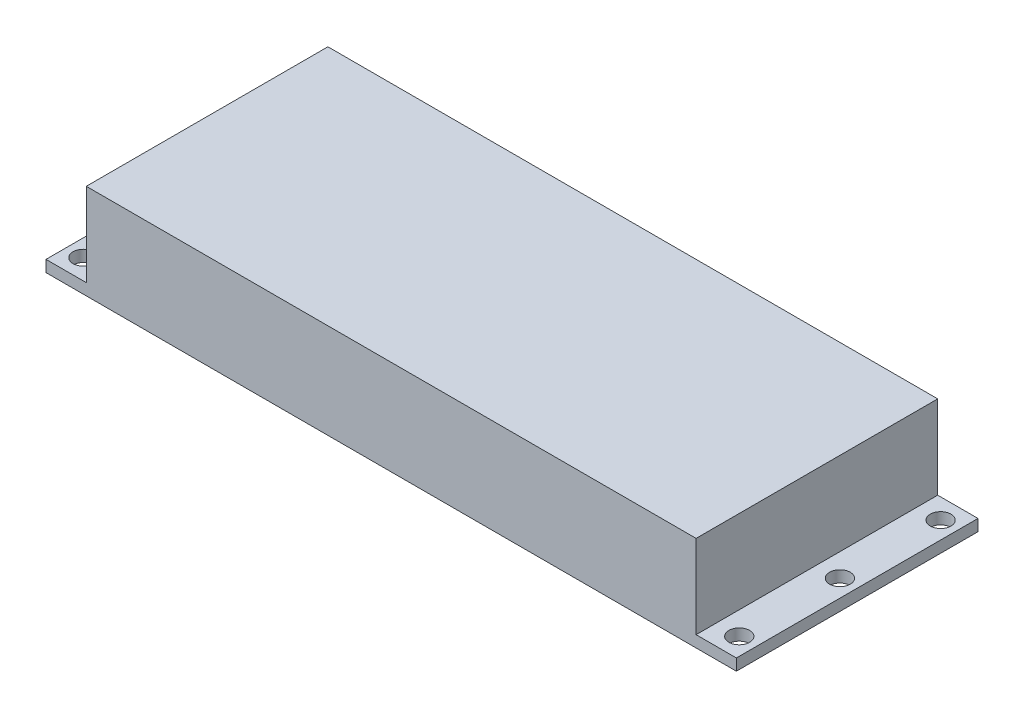
ISO-10303-21;
HEADER;
FILE_DESCRIPTION(('STEP AP214'),'2;1');
FILE_NAME('part.step','',(''),(''),'','','');
FILE_SCHEMA(('AUTOMOTIVE_DESIGN { 1 0 10303 214 1 1 1 1 }'));
ENDSEC;
DATA;
#1=APPLICATION_CONTEXT('core data for automotive mechanical design processes');
#2=APPLICATION_PROTOCOL_DEFINITION('international standard','automotive_design',2000,#1);
#3=PRODUCT_CONTEXT('',#1,'mechanical');
#4=PRODUCT('Part','Part','',(#3));
#5=PRODUCT_RELATED_PRODUCT_CATEGORY('part','',(#4));
#6=PRODUCT_DEFINITION_FORMATION('','',#4);
#7=PRODUCT_DEFINITION_CONTEXT('part definition',#1,'design');
#8=PRODUCT_DEFINITION('design','',#6,#7);
#9=PRODUCT_DEFINITION_SHAPE('','',#8);
#10=(LENGTH_UNIT() NAMED_UNIT(*) SI_UNIT(.MILLI.,.METRE.));
#11=(NAMED_UNIT(*) PLANE_ANGLE_UNIT() SI_UNIT($,.RADIAN.));
#12=(NAMED_UNIT(*) SI_UNIT($,.STERADIAN.) SOLID_ANGLE_UNIT());
#13=UNCERTAINTY_MEASURE_WITH_UNIT(LENGTH_MEASURE(1.E-05),#10,'distance_accuracy_value','');
#14=(GEOMETRIC_REPRESENTATION_CONTEXT(3) GLOBAL_UNCERTAINTY_ASSIGNED_CONTEXT((#13)) GLOBAL_UNIT_ASSIGNED_CONTEXT((#10,
#11,#12)) REPRESENTATION_CONTEXT('',''));
#15=CARTESIAN_POINT('',(0.,0.,0.));
#16=DIRECTION('',(0.,0.,1.));
#17=DIRECTION('',(1.,0.,0.));
#18=AXIS2_PLACEMENT_3D('',#15,#16,#17);
#19=CARTESIAN_POINT('',(0.,2.,0.));
#20=DIRECTION('',(0.,1.,0.));
#21=DIRECTION('',(0.,0.,1.));
#22=AXIS2_PLACEMENT_3D('',#19,#20,#21);
#23=PLANE('',#22);
#24=CARTESIAN_POINT('',(57.,2.,17.5));
#25=DIRECTION('',(0.,1.,0.));
#26=DIRECTION('',(0.,0.,1.));
#27=AXIS2_PLACEMENT_3D('',#24,#25,#26);
#28=CIRCLE('',#27,1.8);
#29=CARTESIAN_POINT('',(57.,2.,19.3));
#30=VERTEX_POINT('',#29);
#31=EDGE_CURVE('E188',#30,#30,#28,.T.);
#32=ORIENTED_EDGE('',*,*,#31,.F.);
#33=EDGE_LOOP('',(#32));
#34=FACE_BOUND('',#33,.T.);
#35=CARTESIAN_POINT('',(57.,2.,-17.5));
#36=DIRECTION('',(0.,1.,0.));
#37=DIRECTION('',(0.,0.,1.));
#38=AXIS2_PLACEMENT_3D('',#35,#36,#37);
#39=CIRCLE('',#38,1.8);
#40=CARTESIAN_POINT('',(57.,2.,-15.7));
#41=VERTEX_POINT('',#40);
#42=EDGE_CURVE('E182',#41,#41,#39,.T.);
#43=ORIENTED_EDGE('',*,*,#42,.F.);
#44=EDGE_LOOP('',(#43));
#45=FACE_BOUND('',#44,.T.);
#46=CARTESIAN_POINT('',(57.,2.,0.));
#47=DIRECTION('',(0.,1.,0.));
#48=DIRECTION('',(0.,0.,1.));
#49=AXIS2_PLACEMENT_3D('',#46,#47,#48);
#50=CIRCLE('',#49,1.8);
#51=CARTESIAN_POINT('',(57.,2.,1.8));
#52=VERTEX_POINT('',#51);
#53=EDGE_CURVE('E176',#52,#52,#50,.T.);
#54=ORIENTED_EDGE('',*,*,#53,.F.);
#55=EDGE_LOOP('',(#54));
#56=FACE_BOUND('',#55,.T.);
#57=DIRECTION('',(0.,0.,-1.));
#58=VECTOR('',#57,1.);
#59=CARTESIAN_POINT('',(53.,2.,-21.));
#60=LINE('',#59,#58);
#61=CARTESIAN_POINT('',(53.,2.,21.));
#62=VERTEX_POINT('',#61);
#63=CARTESIAN_POINT('',(53.,2.,-21.));
#64=VERTEX_POINT('',#63);
#65=EDGE_CURVE('E51',#62,#64,#60,.T.);
#66=ORIENTED_EDGE('',*,*,#65,.F.);
#67=DIRECTION('',(1.,0.,0.));
#68=VECTOR('',#67,1.);
#69=CARTESIAN_POINT('',(-60.,2.,21.));
#70=LINE('',#69,#68);
#71=CARTESIAN_POINT('',(60.,2.,21.));
#72=VERTEX_POINT('',#71);
#73=EDGE_CURVE('E149',#62,#72,#70,.T.);
#74=ORIENTED_EDGE('',*,*,#73,.T.);
#75=DIRECTION('',(0.,0.,-1.));
#76=VECTOR('',#75,1.);
#77=CARTESIAN_POINT('',(60.,2.,-21.));
#78=LINE('',#77,#76);
#79=CARTESIAN_POINT('',(60.,2.,-21.));
#80=VERTEX_POINT('',#79);
#81=EDGE_CURVE('E144',#72,#80,#78,.T.);
#82=ORIENTED_EDGE('',*,*,#81,.T.);
#83=DIRECTION('',(-1.,0.,0.));
#84=VECTOR('',#83,1.);
#85=CARTESIAN_POINT('',(-60.,2.,-21.));
#86=LINE('',#85,#84);
#87=EDGE_CURVE('E244',#80,#64,#86,.T.);
#88=ORIENTED_EDGE('',*,*,#87,.T.);
#89=EDGE_LOOP('',(#66,#74,#82,#88));
#90=FACE_BOUND('',#89,.T.);
#91=ADVANCED_FACE('F34',(#34,#45,#56,#90),#23,.T.);
#92=CARTESIAN_POINT('',(60.,2.,-21.));
#93=DIRECTION('',(-1.,0.,0.));
#94=DIRECTION('',(0.,0.,1.));
#95=AXIS2_PLACEMENT_3D('',#92,#93,#94);
#96=PLANE('',#95);
#97=DIRECTION('',(0.,0.,-1.));
#98=VECTOR('',#97,1.);
#99=CARTESIAN_POINT('',(60.,0.,-21.));
#100=LINE('',#99,#98);
#101=CARTESIAN_POINT('',(60.,0.,21.));
#102=VERTEX_POINT('',#101);
#103=CARTESIAN_POINT('',(60.,0.,-21.));
#104=VERTEX_POINT('',#103);
#105=EDGE_CURVE('E122',#102,#104,#100,.T.);
#106=ORIENTED_EDGE('',*,*,#105,.T.);
#107=DIRECTION('',(0.,-1.,0.));
#108=VECTOR('',#107,1.);
#109=CARTESIAN_POINT('',(60.,2.,-21.));
#110=LINE('',#109,#108);
#111=EDGE_CURVE('E11',#80,#104,#110,.T.);
#112=ORIENTED_EDGE('',*,*,#111,.F.);
#113=ORIENTED_EDGE('',*,*,#81,.F.);
#114=DIRECTION('',(0.,-1.,0.));
#115=VECTOR('',#114,1.);
#116=CARTESIAN_POINT('',(60.,2.,21.));
#117=LINE('',#116,#115);
#118=EDGE_CURVE('E232',#72,#102,#117,.T.);
#119=ORIENTED_EDGE('',*,*,#118,.T.);
#120=EDGE_LOOP('',(#106,#112,#113,#119));
#121=FACE_BOUND('',#120,.T.);
#122=ADVANCED_FACE('F36',(#121),#96,.F.);
#123=CARTESIAN_POINT('',(-60.,2.,-21.));
#124=DIRECTION('',(0.,0.,1.));
#125=DIRECTION('',(1.,0.,0.));
#126=AXIS2_PLACEMENT_3D('',#123,#124,#125);
#127=PLANE('',#126);
#128=DIRECTION('',(-1.,0.,0.));
#129=VECTOR('',#128,1.);
#130=CARTESIAN_POINT('',(-60.,0.,-21.));
#131=LINE('',#130,#129);
#132=CARTESIAN_POINT('',(-60.,0.,-21.));
#133=VERTEX_POINT('',#132);
#134=EDGE_CURVE('E125',#104,#133,#131,.T.);
#135=ORIENTED_EDGE('',*,*,#134,.T.);
#136=DIRECTION('',(0.,-1.,0.));
#137=VECTOR('',#136,1.);
#138=CARTESIAN_POINT('',(-60.,2.,-21.));
#139=LINE('',#138,#137);
#140=CARTESIAN_POINT('',(-60.,2.,-21.));
#141=VERTEX_POINT('',#140);
#142=EDGE_CURVE('E43',#141,#133,#139,.T.);
#143=ORIENTED_EDGE('',*,*,#142,.F.);
#144=CARTESIAN_POINT('',(-53.,2.,-21.));
#145=VERTEX_POINT('',#144);
#146=EDGE_CURVE('E247',#145,#141,#86,.T.);
#147=ORIENTED_EDGE('',*,*,#146,.F.);
#148=DIRECTION('',(0.,-1.,0.));
#149=VECTOR('',#148,1.);
#150=CARTESIAN_POINT('',(-53.,16.5,-21.));
#151=LINE('',#150,#149);
#152=CARTESIAN_POINT('',(-53.,16.5,-21.));
#153=VERTEX_POINT('',#152);
#154=EDGE_CURVE('E107',#153,#145,#151,.T.);
#155=ORIENTED_EDGE('',*,*,#154,.F.);
#156=DIRECTION('',(-1.,0.,0.));
#157=VECTOR('',#156,1.);
#158=CARTESIAN_POINT('',(-53.,16.5,-21.));
#159=LINE('',#158,#157);
#160=CARTESIAN_POINT('',(53.,16.5,-21.));
#161=VERTEX_POINT('',#160);
#162=EDGE_CURVE('E101',#161,#153,#159,.T.);
#163=ORIENTED_EDGE('',*,*,#162,.F.);
#164=DIRECTION('',(0.,-1.,0.));
#165=VECTOR('',#164,1.);
#166=CARTESIAN_POINT('',(53.,16.5,-21.));
#167=LINE('',#166,#165);
#168=EDGE_CURVE('E105',#161,#64,#167,.T.);
#169=ORIENTED_EDGE('',*,*,#168,.T.);
#170=ORIENTED_EDGE('',*,*,#87,.F.);
#171=ORIENTED_EDGE('',*,*,#111,.T.);
#172=EDGE_LOOP('',(#135,#143,#147,#155,#163,#169,#170,#171));
#173=FACE_BOUND('',#172,.T.);
#174=ADVANCED_FACE('F103',(#173),#127,.F.);
#175=CARTESIAN_POINT('',(-60.,2.,-21.));
#176=DIRECTION('',(1.,0.,0.));
#177=DIRECTION('',(0.,0.,-1.));
#178=AXIS2_PLACEMENT_3D('',#175,#176,#177);
#179=PLANE('',#178);
#180=DIRECTION('',(0.,0.,1.));
#181=VECTOR('',#180,1.);
#182=CARTESIAN_POINT('',(-60.,0.,-21.));
#183=LINE('',#182,#181);
#184=CARTESIAN_POINT('',(-60.,0.,21.));
#185=VERTEX_POINT('',#184);
#186=EDGE_CURVE('E254',#133,#185,#183,.T.);
#187=ORIENTED_EDGE('',*,*,#186,.T.);
#188=DIRECTION('',(0.,-1.,0.));
#189=VECTOR('',#188,1.);
#190=CARTESIAN_POINT('',(-60.,2.,21.));
#191=LINE('',#190,#189);
#192=CARTESIAN_POINT('',(-60.,2.,21.));
#193=VERTEX_POINT('',#192);
#194=EDGE_CURVE('E234',#193,#185,#191,.T.);
#195=ORIENTED_EDGE('',*,*,#194,.F.);
#196=DIRECTION('',(0.,0.,1.));
#197=VECTOR('',#196,1.);
#198=CARTESIAN_POINT('',(-60.,2.,-21.));
#199=LINE('',#198,#197);
#200=EDGE_CURVE('E246',#141,#193,#199,.T.);
#201=ORIENTED_EDGE('',*,*,#200,.F.);
#202=ORIENTED_EDGE('',*,*,#142,.T.);
#203=EDGE_LOOP('',(#187,#195,#201,#202));
#204=FACE_BOUND('',#203,.T.);
#205=ADVANCED_FACE('F259',(#204),#179,.F.);
#206=CARTESIAN_POINT('',(-60.,2.,21.));
#207=DIRECTION('',(0.,0.,-1.));
#208=DIRECTION('',(-1.,0.,0.));
#209=AXIS2_PLACEMENT_3D('',#206,#207,#208);
#210=PLANE('',#209);
#211=DIRECTION('',(1.,0.,0.));
#212=VECTOR('',#211,1.);
#213=CARTESIAN_POINT('',(-60.,0.,21.));
#214=LINE('',#213,#212);
#215=EDGE_CURVE('E226',#185,#102,#214,.T.);
#216=ORIENTED_EDGE('',*,*,#215,.T.);
#217=ORIENTED_EDGE('',*,*,#118,.F.);
#218=ORIENTED_EDGE('',*,*,#73,.F.);
#219=DIRECTION('',(0.,-1.,0.));
#220=VECTOR('',#219,1.);
#221=CARTESIAN_POINT('',(53.,16.5,21.));
#222=LINE('',#221,#220);
#223=CARTESIAN_POINT('',(53.,16.5,21.));
#224=VERTEX_POINT('',#223);
#225=EDGE_CURVE('E137',#224,#62,#222,.T.);
#226=ORIENTED_EDGE('',*,*,#225,.F.);
#227=DIRECTION('',(1.,0.,0.));
#228=VECTOR('',#227,1.);
#229=CARTESIAN_POINT('',(-53.,16.5,21.));
#230=LINE('',#229,#228);
#231=CARTESIAN_POINT('',(-53.,16.5,21.));
#232=VERTEX_POINT('',#231);
#233=EDGE_CURVE('E116',#232,#224,#230,.T.);
#234=ORIENTED_EDGE('',*,*,#233,.F.);
#235=DIRECTION('',(0.,-1.,0.));
#236=VECTOR('',#235,1.);
#237=CARTESIAN_POINT('',(-53.,16.5,21.));
#238=LINE('',#237,#236);
#239=CARTESIAN_POINT('',(-53.,2.,21.));
#240=VERTEX_POINT('',#239);
#241=EDGE_CURVE('E127',#232,#240,#238,.T.);
#242=ORIENTED_EDGE('',*,*,#241,.T.);
#243=EDGE_CURVE('E235',#193,#240,#70,.T.);
#244=ORIENTED_EDGE('',*,*,#243,.F.);
#245=ORIENTED_EDGE('',*,*,#194,.T.);
#246=EDGE_LOOP('',(#216,#217,#218,#226,#234,#242,#244,#245));
#247=FACE_BOUND('',#246,.T.);
#248=ADVANCED_FACE('F260',(#247),#210,.F.);
#249=CARTESIAN_POINT('',(-57.,2.,17.5));
#250=DIRECTION('',(0.,1.,0.));
#251=DIRECTION('',(0.,0.,1.));
#252=AXIS2_PLACEMENT_3D('',#249,#250,#251);
#253=CIRCLE('',#252,1.8);
#254=CARTESIAN_POINT('',(-57.,2.,19.3));
#255=VERTEX_POINT('',#254);
#256=EDGE_CURVE('E173',#255,#255,#253,.T.);
#257=ORIENTED_EDGE('',*,*,#256,.F.);
#258=EDGE_LOOP('',(#257));
#259=FACE_BOUND('',#258,.T.);
#260=CARTESIAN_POINT('',(-57.,2.,-17.5));
#261=DIRECTION('',(0.,1.,0.));
#262=DIRECTION('',(0.,0.,1.));
#263=AXIS2_PLACEMENT_3D('',#260,#261,#262);
#264=CIRCLE('',#263,1.8);
#265=CARTESIAN_POINT('',(-57.,2.,-15.7));
#266=VERTEX_POINT('',#265);
#267=EDGE_CURVE('E167',#266,#266,#264,.T.);
#268=ORIENTED_EDGE('',*,*,#267,.F.);
#269=EDGE_LOOP('',(#268));
#270=FACE_BOUND('',#269,.T.);
#271=CARTESIAN_POINT('',(-57.,2.,0.));
#272=DIRECTION('',(0.,1.,0.));
#273=DIRECTION('',(0.,0.,1.));
#274=AXIS2_PLACEMENT_3D('',#271,#272,#273);
#275=CIRCLE('',#274,1.8);
#276=CARTESIAN_POINT('',(-57.,2.,1.8));
#277=VERTEX_POINT('',#276);
#278=EDGE_CURVE('E161',#277,#277,#275,.T.);
#279=ORIENTED_EDGE('',*,*,#278,.F.);
#280=EDGE_LOOP('',(#279));
#281=FACE_BOUND('',#280,.T.);
#282=DIRECTION('',(0.,0.,1.));
#283=VECTOR('',#282,1.);
#284=CARTESIAN_POINT('',(-53.,2.,-21.));
#285=LINE('',#284,#283);
#286=EDGE_CURVE('E59',#145,#240,#285,.T.);
#287=ORIENTED_EDGE('',*,*,#286,.F.);
#288=ORIENTED_EDGE('',*,*,#146,.T.);
#289=ORIENTED_EDGE('',*,*,#200,.T.);
#290=ORIENTED_EDGE('',*,*,#243,.T.);
#291=EDGE_LOOP('',(#287,#288,#289,#290));
#292=FACE_BOUND('',#291,.T.);
#293=ADVANCED_FACE('F198',(#259,#270,#281,#292),#23,.T.);
#294=CARTESIAN_POINT('',(0.,0.,0.));
#295=DIRECTION('',(0.,1.,0.));
#296=DIRECTION('',(0.,0.,1.));
#297=AXIS2_PLACEMENT_3D('',#294,#295,#296);
#298=PLANE('',#297);
#299=CARTESIAN_POINT('',(57.,0.,17.5));
#300=DIRECTION('',(0.,1.,0.));
#301=DIRECTION('',(0.,0.,1.));
#302=AXIS2_PLACEMENT_3D('',#299,#300,#301);
#303=CIRCLE('',#302,1.8);
#304=CARTESIAN_POINT('',(57.,0.,19.3));
#305=VERTEX_POINT('',#304);
#306=EDGE_CURVE('E185',#305,#305,#303,.T.);
#307=ORIENTED_EDGE('',*,*,#306,.T.);
#308=EDGE_LOOP('',(#307));
#309=FACE_BOUND('',#308,.T.);
#310=CARTESIAN_POINT('',(57.,0.,-17.5));
#311=DIRECTION('',(0.,1.,0.));
#312=DIRECTION('',(0.,0.,1.));
#313=AXIS2_PLACEMENT_3D('',#310,#311,#312);
#314=CIRCLE('',#313,1.8);
#315=CARTESIAN_POINT('',(57.,0.,-15.7));
#316=VERTEX_POINT('',#315);
#317=EDGE_CURVE('E179',#316,#316,#314,.T.);
#318=ORIENTED_EDGE('',*,*,#317,.T.);
#319=EDGE_LOOP('',(#318));
#320=FACE_BOUND('',#319,.T.);
#321=CARTESIAN_POINT('',(57.,0.,0.));
#322=DIRECTION('',(0.,1.,0.));
#323=DIRECTION('',(0.,0.,1.));
#324=AXIS2_PLACEMENT_3D('',#321,#322,#323);
#325=CIRCLE('',#324,1.8);
#326=CARTESIAN_POINT('',(57.,0.,1.8));
#327=VERTEX_POINT('',#326);
#328=EDGE_CURVE('E38',#327,#327,#325,.T.);
#329=ORIENTED_EDGE('',*,*,#328,.T.);
#330=EDGE_LOOP('',(#329));
#331=FACE_BOUND('',#330,.T.);
#332=CARTESIAN_POINT('',(-57.,0.,17.5));
#333=DIRECTION('',(0.,1.,0.));
#334=DIRECTION('',(0.,0.,1.));
#335=AXIS2_PLACEMENT_3D('',#332,#333,#334);
#336=CIRCLE('',#335,1.8);
#337=CARTESIAN_POINT('',(-57.,0.,19.3));
#338=VERTEX_POINT('',#337);
#339=EDGE_CURVE('E170',#338,#338,#336,.T.);
#340=ORIENTED_EDGE('',*,*,#339,.T.);
#341=EDGE_LOOP('',(#340));
#342=FACE_BOUND('',#341,.T.);
#343=CARTESIAN_POINT('',(-57.,0.,-17.5));
#344=DIRECTION('',(0.,1.,0.));
#345=DIRECTION('',(0.,0.,1.));
#346=AXIS2_PLACEMENT_3D('',#343,#344,#345);
#347=CIRCLE('',#346,1.8);
#348=CARTESIAN_POINT('',(-57.,0.,-15.7));
#349=VERTEX_POINT('',#348);
#350=EDGE_CURVE('E164',#349,#349,#347,.T.);
#351=ORIENTED_EDGE('',*,*,#350,.T.);
#352=EDGE_LOOP('',(#351));
#353=FACE_BOUND('',#352,.T.);
#354=CARTESIAN_POINT('',(-57.,0.,0.));
#355=DIRECTION('',(0.,1.,0.));
#356=DIRECTION('',(0.,0.,1.));
#357=AXIS2_PLACEMENT_3D('',#354,#355,#356);
#358=CIRCLE('',#357,1.8);
#359=CARTESIAN_POINT('',(-57.,0.,1.8));
#360=VERTEX_POINT('',#359);
#361=EDGE_CURVE('E136',#360,#360,#358,.T.);
#362=ORIENTED_EDGE('',*,*,#361,.T.);
#363=EDGE_LOOP('',(#362));
#364=FACE_BOUND('',#363,.T.);
#365=ORIENTED_EDGE('',*,*,#105,.F.);
#366=ORIENTED_EDGE('',*,*,#215,.F.);
#367=ORIENTED_EDGE('',*,*,#186,.F.);
#368=ORIENTED_EDGE('',*,*,#134,.F.);
#369=EDGE_LOOP('',(#365,#366,#367,#368));
#370=FACE_BOUND('',#369,.T.);
#371=ADVANCED_FACE('F212',(#309,#320,#331,#342,#353,#364,#370),#298,.F.);
#372=CARTESIAN_POINT('',(53.,16.5,-21.));
#373=DIRECTION('',(-1.,0.,0.));
#374=DIRECTION('',(0.,0.,1.));
#375=AXIS2_PLACEMENT_3D('',#372,#373,#374);
#376=PLANE('',#375);
#377=ORIENTED_EDGE('',*,*,#65,.T.);
#378=ORIENTED_EDGE('',*,*,#168,.F.);
#379=DIRECTION('',(0.,0.,-1.));
#380=VECTOR('',#379,1.);
#381=CARTESIAN_POINT('',(53.,16.5,-21.));
#382=LINE('',#381,#380);
#383=EDGE_CURVE('E111',#224,#161,#382,.T.);
#384=ORIENTED_EDGE('',*,*,#383,.F.);
#385=ORIENTED_EDGE('',*,*,#225,.T.);
#386=EDGE_LOOP('',(#377,#378,#384,#385));
#387=FACE_BOUND('',#386,.T.);
#388=ADVANCED_FACE('F121',(#387),#376,.F.);
#389=CARTESIAN_POINT('',(-53.,16.5,-21.));
#390=DIRECTION('',(1.,0.,0.));
#391=DIRECTION('',(0.,0.,-1.));
#392=AXIS2_PLACEMENT_3D('',#389,#390,#391);
#393=PLANE('',#392);
#394=ORIENTED_EDGE('',*,*,#286,.T.);
#395=ORIENTED_EDGE('',*,*,#241,.F.);
#396=DIRECTION('',(0.,0.,1.));
#397=VECTOR('',#396,1.);
#398=CARTESIAN_POINT('',(-53.,16.5,-21.));
#399=LINE('',#398,#397);
#400=EDGE_CURVE('E110',#153,#232,#399,.T.);
#401=ORIENTED_EDGE('',*,*,#400,.F.);
#402=ORIENTED_EDGE('',*,*,#154,.T.);
#403=EDGE_LOOP('',(#394,#395,#401,#402));
#404=FACE_BOUND('',#403,.T.);
#405=ADVANCED_FACE('F262',(#404),#393,.F.);
#406=CARTESIAN_POINT('',(0.,16.5,0.));
#407=DIRECTION('',(0.,1.,0.));
#408=DIRECTION('',(0.,0.,1.));
#409=AXIS2_PLACEMENT_3D('',#406,#407,#408);
#410=PLANE('',#409);
#411=ORIENTED_EDGE('',*,*,#383,.T.);
#412=ORIENTED_EDGE('',*,*,#162,.T.);
#413=ORIENTED_EDGE('',*,*,#400,.T.);
#414=ORIENTED_EDGE('',*,*,#233,.T.);
#415=EDGE_LOOP('',(#411,#412,#413,#414));
#416=FACE_BOUND('',#415,.T.);
#417=ADVANCED_FACE('F114',(#416),#410,.T.);
#418=CARTESIAN_POINT('',(-57.,2.,0.));
#419=DIRECTION('',(0.,1.,0.));
#420=DIRECTION('',(0.,0.,1.));
#421=AXIS2_PLACEMENT_3D('',#418,#419,#420);
#422=CYLINDRICAL_SURFACE('',#421,1.8);
#423=ORIENTED_EDGE('',*,*,#278,.T.);
#424=EDGE_LOOP('',(#423));
#425=FACE_BOUND('',#424,.T.);
#426=ORIENTED_EDGE('',*,*,#361,.F.);
#427=EDGE_LOOP('',(#426));
#428=FACE_BOUND('',#427,.T.);
#429=ADVANCED_FACE('F269',(#425,#428),#422,.F.);
#430=CARTESIAN_POINT('',(-57.,2.,-17.5));
#431=DIRECTION('',(0.,1.,0.));
#432=DIRECTION('',(0.,0.,1.));
#433=AXIS2_PLACEMENT_3D('',#430,#431,#432);
#434=CYLINDRICAL_SURFACE('',#433,1.8);
#435=ORIENTED_EDGE('',*,*,#267,.T.);
#436=EDGE_LOOP('',(#435));
#437=FACE_BOUND('',#436,.T.);
#438=ORIENTED_EDGE('',*,*,#350,.F.);
#439=EDGE_LOOP('',(#438));
#440=FACE_BOUND('',#439,.T.);
#441=ADVANCED_FACE('F332',(#437,#440),#434,.F.);
#442=CARTESIAN_POINT('',(-57.,2.,17.5));
#443=DIRECTION('',(0.,1.,0.));
#444=DIRECTION('',(0.,0.,1.));
#445=AXIS2_PLACEMENT_3D('',#442,#443,#444);
#446=CYLINDRICAL_SURFACE('',#445,1.8);
#447=ORIENTED_EDGE('',*,*,#256,.T.);
#448=EDGE_LOOP('',(#447));
#449=FACE_BOUND('',#448,.T.);
#450=ORIENTED_EDGE('',*,*,#339,.F.);
#451=EDGE_LOOP('',(#450));
#452=FACE_BOUND('',#451,.T.);
#453=ADVANCED_FACE('F207',(#449,#452),#446,.F.);
#454=CARTESIAN_POINT('',(57.,2.,0.));
#455=DIRECTION('',(0.,1.,0.));
#456=DIRECTION('',(0.,0.,1.));
#457=AXIS2_PLACEMENT_3D('',#454,#455,#456);
#458=CYLINDRICAL_SURFACE('',#457,1.8);
#459=ORIENTED_EDGE('',*,*,#53,.T.);
#460=EDGE_LOOP('',(#459));
#461=FACE_BOUND('',#460,.T.);
#462=ORIENTED_EDGE('',*,*,#328,.F.);
#463=EDGE_LOOP('',(#462));
#464=FACE_BOUND('',#463,.T.);
#465=ADVANCED_FACE('F203',(#461,#464),#458,.F.);
#466=CARTESIAN_POINT('',(57.,2.,-17.5));
#467=DIRECTION('',(0.,1.,0.));
#468=DIRECTION('',(0.,0.,1.));
#469=AXIS2_PLACEMENT_3D('',#466,#467,#468);
#470=CYLINDRICAL_SURFACE('',#469,1.8);
#471=ORIENTED_EDGE('',*,*,#42,.T.);
#472=EDGE_LOOP('',(#471));
#473=FACE_BOUND('',#472,.T.);
#474=ORIENTED_EDGE('',*,*,#317,.F.);
#475=EDGE_LOOP('',(#474));
#476=FACE_BOUND('',#475,.T.);
#477=ADVANCED_FACE('F206',(#473,#476),#470,.F.);
#478=CARTESIAN_POINT('',(57.,2.,17.5));
#479=DIRECTION('',(0.,1.,0.));
#480=DIRECTION('',(0.,0.,1.));
#481=AXIS2_PLACEMENT_3D('',#478,#479,#480);
#482=CYLINDRICAL_SURFACE('',#481,1.8);
#483=ORIENTED_EDGE('',*,*,#31,.T.);
#484=EDGE_LOOP('',(#483));
#485=FACE_BOUND('',#484,.T.);
#486=ORIENTED_EDGE('',*,*,#306,.F.);
#487=EDGE_LOOP('',(#486));
#488=FACE_BOUND('',#487,.T.);
#489=ADVANCED_FACE('F192',(#485,#488),#482,.F.);
#490=CLOSED_SHELL('',(#91,#122,#174,#205,#248,#293,#371,#388,#405,#417,#429,#441,#453,#465,#477,#489));
#491=MANIFOLD_SOLID_BREP('B2',#490);
#492=ADVANCED_BREP_SHAPE_REPRESENTATION('',(#18,#491),#14);
#493=SHAPE_DEFINITION_REPRESENTATION(#9,#492);
ENDSEC;
END-ISO-10303-21;
